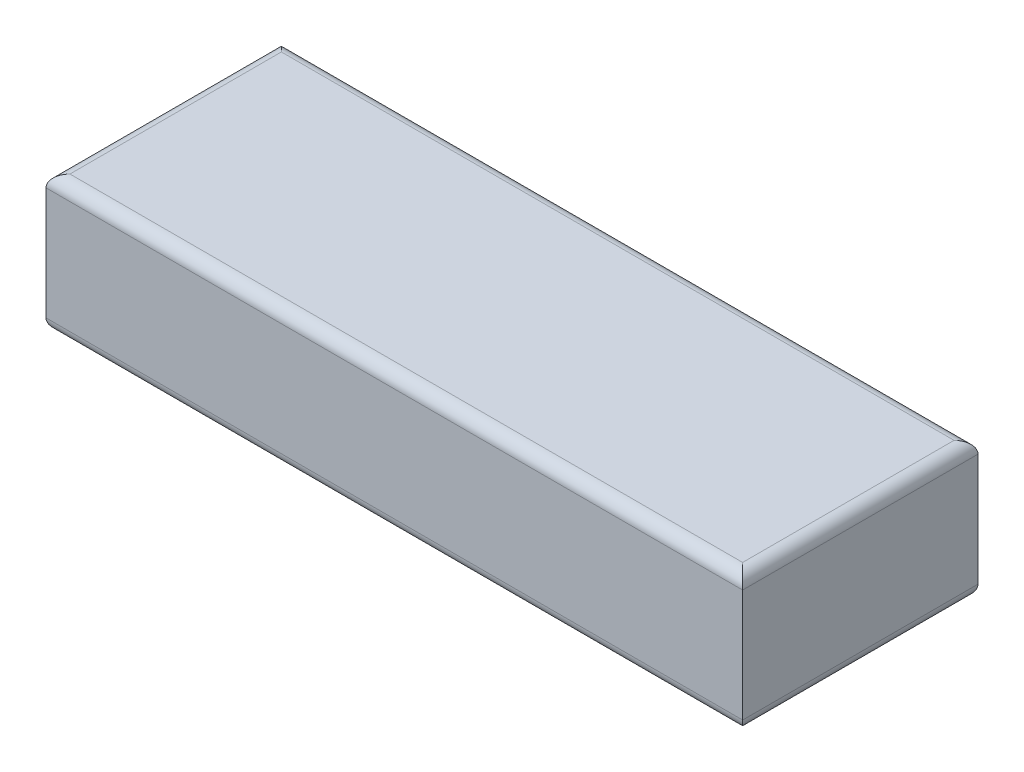
ISO-10303-21;
HEADER;
FILE_DESCRIPTION(('STEP AP214'),'2;1');
FILE_NAME('part.step','',(''),(''),'','','');
FILE_SCHEMA(('AUTOMOTIVE_DESIGN { 1 0 10303 214 1 1 1 1 }'));
ENDSEC;
DATA;
#1=APPLICATION_CONTEXT('core data for automotive mechanical design processes');
#2=APPLICATION_PROTOCOL_DEFINITION('international standard','automotive_design',2000,#1);
#3=PRODUCT_CONTEXT('',#1,'mechanical');
#4=PRODUCT('Part','Part','',(#3));
#5=PRODUCT_RELATED_PRODUCT_CATEGORY('part','',(#4));
#6=PRODUCT_DEFINITION_FORMATION('','',#4);
#7=PRODUCT_DEFINITION_CONTEXT('part definition',#1,'design');
#8=PRODUCT_DEFINITION('design','',#6,#7);
#9=PRODUCT_DEFINITION_SHAPE('','',#8);
#10=(LENGTH_UNIT() NAMED_UNIT(*) SI_UNIT(.MILLI.,.METRE.));
#11=(NAMED_UNIT(*) PLANE_ANGLE_UNIT() SI_UNIT($,.RADIAN.));
#12=(NAMED_UNIT(*) SI_UNIT($,.STERADIAN.) SOLID_ANGLE_UNIT());
#13=UNCERTAINTY_MEASURE_WITH_UNIT(LENGTH_MEASURE(1.E-05),#10,'distance_accuracy_value','');
#14=(GEOMETRIC_REPRESENTATION_CONTEXT(3) GLOBAL_UNCERTAINTY_ASSIGNED_CONTEXT((#13)) GLOBAL_UNIT_ASSIGNED_CONTEXT((#10,
#11,#12)) REPRESENTATION_CONTEXT('',''));
#15=CARTESIAN_POINT('',(0.,0.,0.));
#16=DIRECTION('',(0.,0.,1.));
#17=DIRECTION('',(1.,0.,0.));
#18=AXIS2_PLACEMENT_3D('',#15,#16,#17);
#19=CARTESIAN_POINT('',(-2.70634920634921,29.,52.4148197575396));
#20=DIRECTION('',(1.,0.,0.));
#21=DIRECTION('',(0.,0.,-1.));
#22=AXIS2_PLACEMENT_3D('',#19,#20,#21);
#23=PLANE('',#22);
#24=DIRECTION('',(0.,-1.,0.));
#25=VECTOR('',#24,1.);
#26=CARTESIAN_POINT('',(-2.70634920634921,29.,2.41481975753958));
#27=LINE('',#26,#25);
#28=CARTESIAN_POINT('',(-2.70634920634921,26.46,2.41481975753958));
#29=VERTEX_POINT('',#28);
#30=CARTESIAN_POINT('',(-2.70634920634921,2.54000000000001,2.41481975753958));
#31=VERTEX_POINT('',#30);
#32=EDGE_CURVE('E142',#29,#31,#27,.T.);
#33=ORIENTED_EDGE('',*,*,#32,.T.);
#34=DIRECTION('',(0.,0.,1.));
#35=VECTOR('',#34,1.);
#36=CARTESIAN_POINT('',(-2.70634920634921,2.54,52.4148197575396));
#37=LINE('',#36,#35);
#38=CARTESIAN_POINT('',(-2.70634920634921,2.54000000000001,52.4148197575396));
#39=VERTEX_POINT('',#38);
#40=EDGE_CURVE('E151',#31,#39,#37,.T.);
#41=ORIENTED_EDGE('',*,*,#40,.T.);
#42=DIRECTION('',(0.,-1.,0.));
#43=VECTOR('',#42,1.);
#44=CARTESIAN_POINT('',(-2.70634920634921,29.,52.4148197575396));
#45=LINE('',#44,#43);
#46=CARTESIAN_POINT('',(-2.70634920634921,26.46,52.4148197575396));
#47=VERTEX_POINT('',#46);
#48=EDGE_CURVE('E120',#47,#39,#45,.T.);
#49=ORIENTED_EDGE('',*,*,#48,.F.);
#50=DIRECTION('',(0.,0.,1.));
#51=VECTOR('',#50,1.);
#52=CARTESIAN_POINT('',(-2.70634920634921,26.46,52.4148197575396));
#53=LINE('',#52,#51);
#54=EDGE_CURVE('E153',#47,#29,#53,.F.);
#55=ORIENTED_EDGE('',*,*,#54,.T.);
#56=EDGE_LOOP('',(#33,#41,#49,#55));
#57=FACE_BOUND('',#56,.T.);
#58=ADVANCED_FACE('F33',(#57),#23,.F.);
#59=CARTESIAN_POINT('',(-2.70634920634921,29.,52.4148197575396));
#60=DIRECTION('',(0.,0.,-1.));
#61=DIRECTION('',(-1.,0.,0.));
#62=AXIS2_PLACEMENT_3D('',#59,#60,#61);
#63=PLANE('',#62);
#64=ORIENTED_EDGE('',*,*,#48,.T.);
#65=DIRECTION('',(1.,0.,0.));
#66=VECTOR('',#65,1.);
#67=CARTESIAN_POINT('',(145.293650793651,2.54,52.4148197575396));
#68=LINE('',#67,#66);
#69=CARTESIAN_POINT('',(145.293650793651,2.54000000000001,52.4148197575396));
#70=VERTEX_POINT('',#69);
#71=EDGE_CURVE('E119',#39,#70,#68,.T.);
#72=ORIENTED_EDGE('',*,*,#71,.T.);
#73=DIRECTION('',(0.,-1.,0.));
#74=VECTOR('',#73,1.);
#75=CARTESIAN_POINT('',(145.293650793651,29.,52.4148197575396));
#76=LINE('',#75,#74);
#77=CARTESIAN_POINT('',(145.293650793651,26.46,52.4148197575396));
#78=VERTEX_POINT('',#77);
#79=EDGE_CURVE('E102',#78,#70,#76,.T.);
#80=ORIENTED_EDGE('',*,*,#79,.F.);
#81=DIRECTION('',(1.,0.,0.));
#82=VECTOR('',#81,1.);
#83=CARTESIAN_POINT('',(-2.70634920634921,26.46,52.4148197575396));
#84=LINE('',#83,#82);
#85=EDGE_CURVE('E116',#78,#47,#84,.F.);
#86=ORIENTED_EDGE('',*,*,#85,.T.);
#87=EDGE_LOOP('',(#64,#72,#80,#86));
#88=FACE_BOUND('',#87,.T.);
#89=ADVANCED_FACE('F115',(#88),#63,.F.);
#90=CARTESIAN_POINT('',(145.293650793651,29.,52.4148197575396));
#91=DIRECTION('',(-1.,0.,0.));
#92=DIRECTION('',(0.,0.,1.));
#93=AXIS2_PLACEMENT_3D('',#90,#91,#92);
#94=PLANE('',#93);
#95=ORIENTED_EDGE('',*,*,#79,.T.);
#96=DIRECTION('',(0.,0.,-1.));
#97=VECTOR('',#96,1.);
#98=CARTESIAN_POINT('',(145.293650793651,2.54,2.41481975753958));
#99=LINE('',#98,#97);
#100=CARTESIAN_POINT('',(145.293650793651,2.54000000000001,2.41481975753958));
#101=VERTEX_POINT('',#100);
#102=EDGE_CURVE('E108',#70,#101,#99,.T.);
#103=ORIENTED_EDGE('',*,*,#102,.T.);
#104=DIRECTION('',(0.,-1.,0.));
#105=VECTOR('',#104,1.);
#106=CARTESIAN_POINT('',(145.293650793651,29.,2.41481975753958));
#107=LINE('',#106,#105);
#108=CARTESIAN_POINT('',(145.293650793651,26.46,2.41481975753958));
#109=VERTEX_POINT('',#108);
#110=EDGE_CURVE('E104',#109,#101,#107,.T.);
#111=ORIENTED_EDGE('',*,*,#110,.F.);
#112=DIRECTION('',(0.,0.,-1.));
#113=VECTOR('',#112,1.);
#114=CARTESIAN_POINT('',(145.293650793651,26.46,52.4148197575396));
#115=LINE('',#114,#113);
#116=EDGE_CURVE('E99',#109,#78,#115,.F.);
#117=ORIENTED_EDGE('',*,*,#116,.T.);
#118=EDGE_LOOP('',(#95,#103,#111,#117));
#119=FACE_BOUND('',#118,.T.);
#120=ADVANCED_FACE('F101',(#119),#94,.F.);
#121=CARTESIAN_POINT('',(-2.70634920634921,29.,2.41481975753958));
#122=DIRECTION('',(0.,0.,1.));
#123=DIRECTION('',(1.,0.,0.));
#124=AXIS2_PLACEMENT_3D('',#121,#122,#123);
#125=PLANE('',#124);
#126=ORIENTED_EDGE('',*,*,#110,.T.);
#127=DIRECTION('',(-1.,0.,0.));
#128=VECTOR('',#127,1.);
#129=CARTESIAN_POINT('',(-2.70634920634921,2.54,2.41481975753958));
#130=LINE('',#129,#128);
#131=EDGE_CURVE('E155',#101,#31,#130,.T.);
#132=ORIENTED_EDGE('',*,*,#131,.T.);
#133=ORIENTED_EDGE('',*,*,#32,.F.);
#134=DIRECTION('',(-1.,0.,0.));
#135=VECTOR('',#134,1.);
#136=CARTESIAN_POINT('',(-2.70634920634921,26.46,2.41481975753958));
#137=LINE('',#136,#135);
#138=EDGE_CURVE('E157',#29,#109,#137,.F.);
#139=ORIENTED_EDGE('',*,*,#138,.T.);
#140=EDGE_LOOP('',(#126,#132,#133,#139));
#141=FACE_BOUND('',#140,.T.);
#142=ADVANCED_FACE('F195',(#141),#125,.F.);
#143=CARTESIAN_POINT('',(0.,29.,0.));
#144=DIRECTION('',(0.,-1.,0.));
#145=DIRECTION('',(0.,0.,-1.));
#146=AXIS2_PLACEMENT_3D('',#143,#144,#145);
#147=PLANE('',#146);
#148=DIRECTION('',(0.,0.,-1.));
#149=VECTOR('',#148,1.);
#150=CARTESIAN_POINT('',(142.753650793651,29.,0.));
#151=LINE('',#150,#149);
#152=CARTESIAN_POINT('',(142.753650793651,29.,49.8748197575396));
#153=VERTEX_POINT('',#152);
#154=CARTESIAN_POINT('',(142.753650793651,29.,4.95481975753958));
#155=VERTEX_POINT('',#154);
#156=EDGE_CURVE('E42',#153,#155,#151,.T.);
#157=ORIENTED_EDGE('',*,*,#156,.T.);
#158=DIRECTION('',(-1.,0.,0.));
#159=VECTOR('',#158,1.);
#160=CARTESIAN_POINT('',(0.,29.,4.95481975753958));
#161=LINE('',#160,#159);
#162=CARTESIAN_POINT('',(-0.166349206349206,29.,4.95481975753958));
#163=VERTEX_POINT('',#162);
#164=EDGE_CURVE('E11',#155,#163,#161,.T.);
#165=ORIENTED_EDGE('',*,*,#164,.T.);
#166=DIRECTION('',(0.,0.,1.));
#167=VECTOR('',#166,1.);
#168=CARTESIAN_POINT('',(-0.166349206349206,29.,0.));
#169=LINE('',#168,#167);
#170=CARTESIAN_POINT('',(-0.166349206349206,29.,49.8748197575396));
#171=VERTEX_POINT('',#170);
#172=EDGE_CURVE('E149',#163,#171,#169,.T.);
#173=ORIENTED_EDGE('',*,*,#172,.T.);
#174=DIRECTION('',(1.,0.,0.));
#175=VECTOR('',#174,1.);
#176=CARTESIAN_POINT('',(0.,29.,49.8748197575396));
#177=LINE('',#176,#175);
#178=EDGE_CURVE('E53',#171,#153,#177,.T.);
#179=ORIENTED_EDGE('',*,*,#178,.T.);
#180=EDGE_LOOP('',(#157,#165,#173,#179));
#181=FACE_BOUND('',#180,.T.);
#182=ADVANCED_FACE('F201',(#181),#147,.F.);
#183=CARTESIAN_POINT('',(0.,0.,0.));
#184=DIRECTION('',(0.,-1.,0.));
#185=DIRECTION('',(0.,0.,-1.));
#186=AXIS2_PLACEMENT_3D('',#183,#184,#185);
#187=PLANE('',#186);
#188=DIRECTION('',(0.,0.,-1.));
#189=VECTOR('',#188,1.);
#190=CARTESIAN_POINT('',(142.753650793651,0.,52.4148197575396));
#191=LINE('',#190,#189);
#192=CARTESIAN_POINT('',(142.753650793651,0.,4.95481975753958));
#193=VERTEX_POINT('',#192);
#194=CARTESIAN_POINT('',(142.753650793651,0.,49.8748197575396));
#195=VERTEX_POINT('',#194);
#196=EDGE_CURVE('E162',#193,#195,#191,.F.);
#197=ORIENTED_EDGE('',*,*,#196,.T.);
#198=DIRECTION('',(1.,0.,0.));
#199=VECTOR('',#198,1.);
#200=CARTESIAN_POINT('',(-2.70634920634921,0.,49.8748197575396));
#201=LINE('',#200,#199);
#202=CARTESIAN_POINT('',(-0.166349206349206,0.,49.8748197575396));
#203=VERTEX_POINT('',#202);
#204=EDGE_CURVE('E109',#195,#203,#201,.F.);
#205=ORIENTED_EDGE('',*,*,#204,.T.);
#206=DIRECTION('',(0.,0.,1.));
#207=VECTOR('',#206,1.);
#208=CARTESIAN_POINT('',(-0.166349206349206,0.,2.41481975753958));
#209=LINE('',#208,#207);
#210=CARTESIAN_POINT('',(-0.166349206349206,0.,4.95481975753958));
#211=VERTEX_POINT('',#210);
#212=EDGE_CURVE('E166',#203,#211,#209,.F.);
#213=ORIENTED_EDGE('',*,*,#212,.T.);
#214=DIRECTION('',(-1.,0.,0.));
#215=VECTOR('',#214,1.);
#216=CARTESIAN_POINT('',(145.293650793651,0.,4.95481975753958));
#217=LINE('',#216,#215);
#218=EDGE_CURVE('E164',#211,#193,#217,.F.);
#219=ORIENTED_EDGE('',*,*,#218,.T.);
#220=EDGE_LOOP('',(#197,#205,#213,#219));
#221=FACE_BOUND('',#220,.T.);
#222=ADVANCED_FACE('F203',(#221),#187,.T.);
#223=CARTESIAN_POINT('',(-2.70634920634921,2.54,4.95481975753958));
#224=DIRECTION('',(1.,0.,0.));
#225=DIRECTION('',(0.,0.,-1.));
#226=AXIS2_PLACEMENT_3D('',#223,#224,#225);
#227=CYLINDRICAL_SURFACE('',#226,2.54);
#228=CARTESIAN_POINT('',(142.753650793651,2.54,4.95481975753958));
#229=DIRECTION('',(0.707106781186547,0.,0.707106781186547));
#230=DIRECTION('',(0.707106781186547,0.,-0.707106781186547));
#231=AXIS2_PLACEMENT_3D('',#228,#229,#230);
#232=ELLIPSE('',#231,3.59210244842766,2.54);
#233=EDGE_CURVE('E143',#193,#101,#232,.T.);
#234=ORIENTED_EDGE('',*,*,#233,.F.);
#235=ORIENTED_EDGE('',*,*,#218,.F.);
#236=CARTESIAN_POINT('',(-0.166349206349206,2.54,4.95481975753958));
#237=DIRECTION('',(0.707106781186547,0.,-0.707106781186547));
#238=DIRECTION('',(-0.707106781186547,0.,-0.707106781186547));
#239=AXIS2_PLACEMENT_3D('',#236,#237,#238);
#240=ELLIPSE('',#239,3.59210244842766,2.54);
#241=EDGE_CURVE('E139',#31,#211,#240,.F.);
#242=ORIENTED_EDGE('',*,*,#241,.F.);
#243=ORIENTED_EDGE('',*,*,#131,.F.);
#244=EDGE_LOOP('',(#234,#235,#242,#243));
#245=FACE_BOUND('',#244,.T.);
#246=ADVANCED_FACE('F182',(#245),#227,.T.);
#247=CARTESIAN_POINT('',(-0.166349206349206,2.54,52.4148197575396));
#248=DIRECTION('',(0.,0.,-1.));
#249=DIRECTION('',(-1.,0.,0.));
#250=AXIS2_PLACEMENT_3D('',#247,#248,#249);
#251=CYLINDRICAL_SURFACE('',#250,2.54);
#252=ORIENTED_EDGE('',*,*,#241,.T.);
#253=ORIENTED_EDGE('',*,*,#212,.F.);
#254=CARTESIAN_POINT('',(-0.166349206349206,2.54,49.8748197575396));
#255=DIRECTION('',(-0.707106781186547,0.,-0.707106781186547));
#256=DIRECTION('',(0.707106781186547,0.,-0.707106781186547));
#257=AXIS2_PLACEMENT_3D('',#254,#255,#256);
#258=ELLIPSE('',#257,3.59210244842766,2.54);
#259=EDGE_CURVE('E130',#39,#203,#258,.F.);
#260=ORIENTED_EDGE('',*,*,#259,.F.);
#261=ORIENTED_EDGE('',*,*,#40,.F.);
#262=EDGE_LOOP('',(#252,#253,#260,#261));
#263=FACE_BOUND('',#262,.T.);
#264=ADVANCED_FACE('F186',(#263),#251,.T.);
#265=CARTESIAN_POINT('',(142.753650793651,2.54,52.4148197575396));
#266=DIRECTION('',(0.,0.,1.));
#267=DIRECTION('',(1.,0.,0.));
#268=AXIS2_PLACEMENT_3D('',#265,#266,#267);
#269=CYLINDRICAL_SURFACE('',#268,2.54);
#270=ORIENTED_EDGE('',*,*,#233,.T.);
#271=ORIENTED_EDGE('',*,*,#102,.F.);
#272=CARTESIAN_POINT('',(142.753650793651,2.54,49.8748197575396));
#273=DIRECTION('',(-0.707106781186547,0.,0.707106781186547));
#274=DIRECTION('',(0.707106781186547,0.,0.707106781186547));
#275=AXIS2_PLACEMENT_3D('',#272,#273,#274);
#276=ELLIPSE('',#275,3.59210244842766,2.54);
#277=EDGE_CURVE('E129',#195,#70,#276,.T.);
#278=ORIENTED_EDGE('',*,*,#277,.F.);
#279=ORIENTED_EDGE('',*,*,#196,.F.);
#280=EDGE_LOOP('',(#270,#271,#278,#279));
#281=FACE_BOUND('',#280,.T.);
#282=ADVANCED_FACE('F194',(#281),#269,.T.);
#283=CARTESIAN_POINT('',(-2.70634920634921,2.54,49.8748197575396));
#284=DIRECTION('',(-1.,0.,0.));
#285=DIRECTION('',(0.,0.,1.));
#286=AXIS2_PLACEMENT_3D('',#283,#284,#285);
#287=CYLINDRICAL_SURFACE('',#286,2.54);
#288=ORIENTED_EDGE('',*,*,#259,.T.);
#289=ORIENTED_EDGE('',*,*,#204,.F.);
#290=ORIENTED_EDGE('',*,*,#277,.T.);
#291=ORIENTED_EDGE('',*,*,#71,.F.);
#292=EDGE_LOOP('',(#288,#289,#290,#291));
#293=FACE_BOUND('',#292,.T.);
#294=ADVANCED_FACE('F189',(#293),#287,.T.);
#295=CARTESIAN_POINT('',(0.,26.46,49.8748197575396));
#296=DIRECTION('',(1.,0.,0.));
#297=DIRECTION('',(0.,0.,-1.));
#298=AXIS2_PLACEMENT_3D('',#295,#296,#297);
#299=CYLINDRICAL_SURFACE('',#298,2.54);
#300=CARTESIAN_POINT('',(-0.166349206349206,26.46,49.8748197575396));
#301=DIRECTION('',(0.707106781186547,0.,0.707106781186547));
#302=DIRECTION('',(-0.707106781186547,0.,0.707106781186547));
#303=AXIS2_PLACEMENT_3D('',#300,#301,#302);
#304=ELLIPSE('',#303,3.59210244842766,2.54);
#305=EDGE_CURVE('E125',#47,#171,#304,.F.);
#306=ORIENTED_EDGE('',*,*,#305,.F.);
#307=ORIENTED_EDGE('',*,*,#85,.F.);
#308=CARTESIAN_POINT('',(142.753650793651,26.46,49.8748197575396));
#309=DIRECTION('',(0.707106781186547,0.,-0.707106781186547));
#310=DIRECTION('',(0.707106781186547,0.,0.707106781186547));
#311=AXIS2_PLACEMENT_3D('',#308,#309,#310);
#312=ELLIPSE('',#311,3.59210244842766,2.54);
#313=EDGE_CURVE('E37',#153,#78,#312,.T.);
#314=ORIENTED_EDGE('',*,*,#313,.F.);
#315=ORIENTED_EDGE('',*,*,#178,.F.);
#316=EDGE_LOOP('',(#306,#307,#314,#315));
#317=FACE_BOUND('',#316,.T.);
#318=ADVANCED_FACE('F35',(#317),#299,.T.);
#319=CARTESIAN_POINT('',(142.753650793651,26.46,0.));
#320=DIRECTION('',(0.,0.,-1.));
#321=DIRECTION('',(-1.,0.,0.));
#322=AXIS2_PLACEMENT_3D('',#319,#320,#321);
#323=CYLINDRICAL_SURFACE('',#322,2.54);
#324=ORIENTED_EDGE('',*,*,#313,.T.);
#325=ORIENTED_EDGE('',*,*,#116,.F.);
#326=CARTESIAN_POINT('',(142.753650793651,26.46,4.95481975753958));
#327=DIRECTION('',(-0.707106781186547,0.,-0.707106781186547));
#328=DIRECTION('',(0.707106781186547,0.,-0.707106781186547));
#329=AXIS2_PLACEMENT_3D('',#326,#327,#328);
#330=ELLIPSE('',#329,3.59210244842766,2.54);
#331=EDGE_CURVE('E132',#155,#109,#330,.T.);
#332=ORIENTED_EDGE('',*,*,#331,.F.);
#333=ORIENTED_EDGE('',*,*,#156,.F.);
#334=EDGE_LOOP('',(#324,#325,#332,#333));
#335=FACE_BOUND('',#334,.T.);
#336=ADVANCED_FACE('F128',(#335),#323,.T.);
#337=CARTESIAN_POINT('',(-0.166349206349206,26.46,0.));
#338=DIRECTION('',(0.,0.,1.));
#339=DIRECTION('',(1.,0.,0.));
#340=AXIS2_PLACEMENT_3D('',#337,#338,#339);
#341=CYLINDRICAL_SURFACE('',#340,2.54);
#342=ORIENTED_EDGE('',*,*,#305,.T.);
#343=ORIENTED_EDGE('',*,*,#172,.F.);
#344=CARTESIAN_POINT('',(-0.166349206349206,26.46,4.95481975753958));
#345=DIRECTION('',(-0.707106781186547,0.,0.707106781186547));
#346=DIRECTION('',(0.707106781186547,0.,0.707106781186547));
#347=AXIS2_PLACEMENT_3D('',#344,#345,#346);
#348=ELLIPSE('',#347,3.59210244842766,2.54);
#349=EDGE_CURVE('E135',#29,#163,#348,.F.);
#350=ORIENTED_EDGE('',*,*,#349,.F.);
#351=ORIENTED_EDGE('',*,*,#54,.F.);
#352=EDGE_LOOP('',(#342,#343,#350,#351));
#353=FACE_BOUND('',#352,.T.);
#354=ADVANCED_FACE('F200',(#353),#341,.T.);
#355=CARTESIAN_POINT('',(0.,26.46,4.95481975753958));
#356=DIRECTION('',(-1.,0.,0.));
#357=DIRECTION('',(0.,0.,1.));
#358=AXIS2_PLACEMENT_3D('',#355,#356,#357);
#359=CYLINDRICAL_SURFACE('',#358,2.54);
#360=ORIENTED_EDGE('',*,*,#331,.T.);
#361=ORIENTED_EDGE('',*,*,#138,.F.);
#362=ORIENTED_EDGE('',*,*,#349,.T.);
#363=ORIENTED_EDGE('',*,*,#164,.F.);
#364=EDGE_LOOP('',(#360,#361,#362,#363));
#365=FACE_BOUND('',#364,.T.);
#366=ADVANCED_FACE('F198',(#365),#359,.T.);
#367=CLOSED_SHELL('',(#58,#89,#120,#142,#182,#222,#246,#264,#282,#294,#318,#336,#354,#366));
#368=MANIFOLD_SOLID_BREP('B2',#367);
#369=ADVANCED_BREP_SHAPE_REPRESENTATION('',(#18,#368),#14);
#370=SHAPE_DEFINITION_REPRESENTATION(#9,#369);
ENDSEC;
END-ISO-10303-21;
